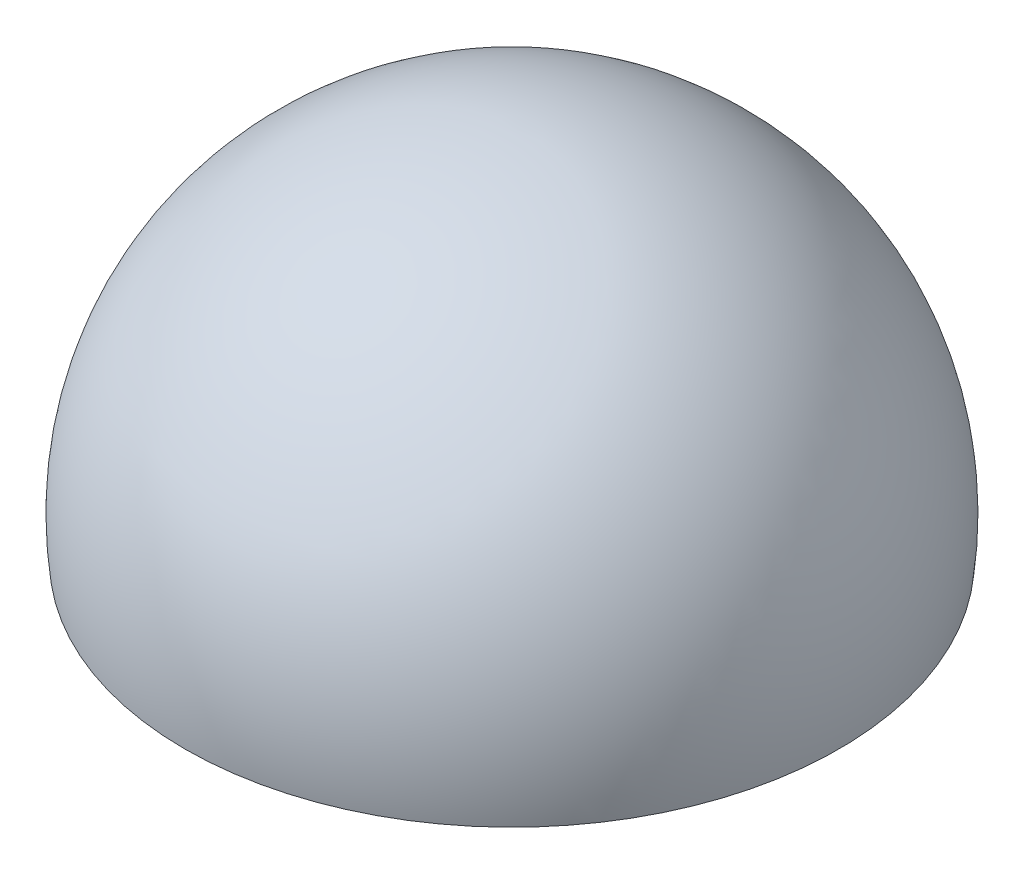
ISO-10303-21;
HEADER;
FILE_DESCRIPTION(('STEP AP214'),'2;1');
FILE_NAME('part.step','',(''),(''),'','','');
FILE_SCHEMA(('AUTOMOTIVE_DESIGN { 1 0 10303 214 1 1 1 1 }'));
ENDSEC;
DATA;
#1=APPLICATION_CONTEXT('core data for automotive mechanical design processes');
#2=APPLICATION_PROTOCOL_DEFINITION('international standard','automotive_design',2000,#1);
#3=PRODUCT_CONTEXT('',#1,'mechanical');
#4=PRODUCT('Part','Part','',(#3));
#5=PRODUCT_RELATED_PRODUCT_CATEGORY('part','',(#4));
#6=PRODUCT_DEFINITION_FORMATION('','',#4);
#7=PRODUCT_DEFINITION_CONTEXT('part definition',#1,'design');
#8=PRODUCT_DEFINITION('design','',#6,#7);
#9=PRODUCT_DEFINITION_SHAPE('','',#8);
#10=(LENGTH_UNIT() NAMED_UNIT(*) SI_UNIT(.MILLI.,.METRE.));
#11=(NAMED_UNIT(*) PLANE_ANGLE_UNIT() SI_UNIT($,.RADIAN.));
#12=(NAMED_UNIT(*) SI_UNIT($,.STERADIAN.) SOLID_ANGLE_UNIT());
#13=UNCERTAINTY_MEASURE_WITH_UNIT(LENGTH_MEASURE(1.E-05),#10,'distance_accuracy_value','');
#14=(GEOMETRIC_REPRESENTATION_CONTEXT(3) GLOBAL_UNCERTAINTY_ASSIGNED_CONTEXT((#13)) GLOBAL_UNIT_ASSIGNED_CONTEXT((#10,
#11,#12)) REPRESENTATION_CONTEXT('',''));
#15=CARTESIAN_POINT('',(0.,0.,0.));
#16=DIRECTION('',(0.,0.,1.));
#17=DIRECTION('',(1.,0.,0.));
#18=AXIS2_PLACEMENT_3D('',#15,#16,#17);
#19=CARTESIAN_POINT('',(0.,0.941176470588236,0.));
#20=DIRECTION('',(0.,-1.,0.));
#21=DIRECTION('',(0.,0.,-1.));
#22=AXIS2_PLACEMENT_3D('',#19,#20,#21);
#23=SPHERICAL_SURFACE('',#22,7.55882352941176);
#24=CARTESIAN_POINT('',(0.,0.,0.));
#25=DIRECTION('',(0.,-1.,0.));
#26=DIRECTION('',(0.,0.,-1.));
#27=AXIS2_PLACEMENT_3D('',#24,#25,#26);
#28=CIRCLE('',#27,7.5);
#29=CARTESIAN_POINT('',(0.,0.,-7.5));
#30=VERTEX_POINT('',#29);
#31=EDGE_CURVE('E10',#30,#30,#28,.T.);
#32=ORIENTED_EDGE('',*,*,#31,.F.);
#33=EDGE_LOOP('',(#32));
#34=FACE_BOUND('',#33,.T.);
#35=ADVANCED_FACE('F39',(#34),#23,.T.);
#36=CARTESIAN_POINT('',(0.,0.,0.));
#37=DIRECTION('',(0.,-1.,0.));
#38=DIRECTION('',(0.,0.,-1.));
#39=AXIS2_PLACEMENT_3D('',#36,#37,#38);
#40=PLANE('',#39);
#41=CARTESIAN_POINT('',(0.,0.,0.));
#42=DIRECTION('',(0.,1.,0.));
#43=DIRECTION('',(0.,0.,1.));
#44=AXIS2_PLACEMENT_3D('',#41,#42,#43);
#45=CIRCLE('',#44,2.55);
#46=CARTESIAN_POINT('',(0.,0.,2.55));
#47=VERTEX_POINT('',#46);
#48=EDGE_CURVE('E51',#47,#47,#45,.T.);
#49=ORIENTED_EDGE('',*,*,#48,.T.);
#50=EDGE_LOOP('',(#49));
#51=FACE_BOUND('',#50,.T.);
#52=ORIENTED_EDGE('',*,*,#31,.T.);
#53=EDGE_LOOP('',(#52));
#54=FACE_BOUND('',#53,.T.);
#55=ADVANCED_FACE('F59',(#51,#54),#40,.T.);
#56=CARTESIAN_POINT('',(0.,0.,0.));
#57=DIRECTION('',(0.,1.,0.));
#58=DIRECTION('',(0.,0.,1.));
#59=AXIS2_PLACEMENT_3D('',#56,#57,#58);
#60=CYLINDRICAL_SURFACE('',#59,2.55);
#61=CARTESIAN_POINT('',(0.,2.,0.));
#62=DIRECTION('',(0.,1.,0.));
#63=DIRECTION('',(0.,0.,1.));
#64=AXIS2_PLACEMENT_3D('',#61,#62,#63);
#65=CIRCLE('',#64,2.55);
#66=CARTESIAN_POINT('',(0.,2.,2.55));
#67=VERTEX_POINT('',#66);
#68=EDGE_CURVE('E46',#67,#67,#65,.T.);
#69=ORIENTED_EDGE('',*,*,#68,.T.);
#70=EDGE_LOOP('',(#69));
#71=FACE_BOUND('',#70,.T.);
#72=ORIENTED_EDGE('',*,*,#48,.F.);
#73=EDGE_LOOP('',(#72));
#74=FACE_BOUND('',#73,.T.);
#75=ADVANCED_FACE('F61',(#71,#74),#60,.F.);
#76=CARTESIAN_POINT('',(0.,3.84975,0.));
#77=DIRECTION('',(0.,1.,0.));
#78=DIRECTION('',(0.,0.,-1.));
#79=AXIS2_PLACEMENT_3D('',#76,#77,#78);
#80=SPHERICAL_SURFACE('',#79,3.15025);
#81=ORIENTED_EDGE('',*,*,#68,.F.);
#82=EDGE_LOOP('',(#81));
#83=FACE_BOUND('',#82,.T.);
#84=ADVANCED_FACE('F63',(#83),#80,.F.);
#85=CLOSED_SHELL('',(#35,#55,#75,#84));
#86=MANIFOLD_SOLID_BREP('B2',#85);
#87=ADVANCED_BREP_SHAPE_REPRESENTATION('',(#18,#86),#14);
#88=SHAPE_DEFINITION_REPRESENTATION(#9,#87);
ENDSEC;
END-ISO-10303-21;
